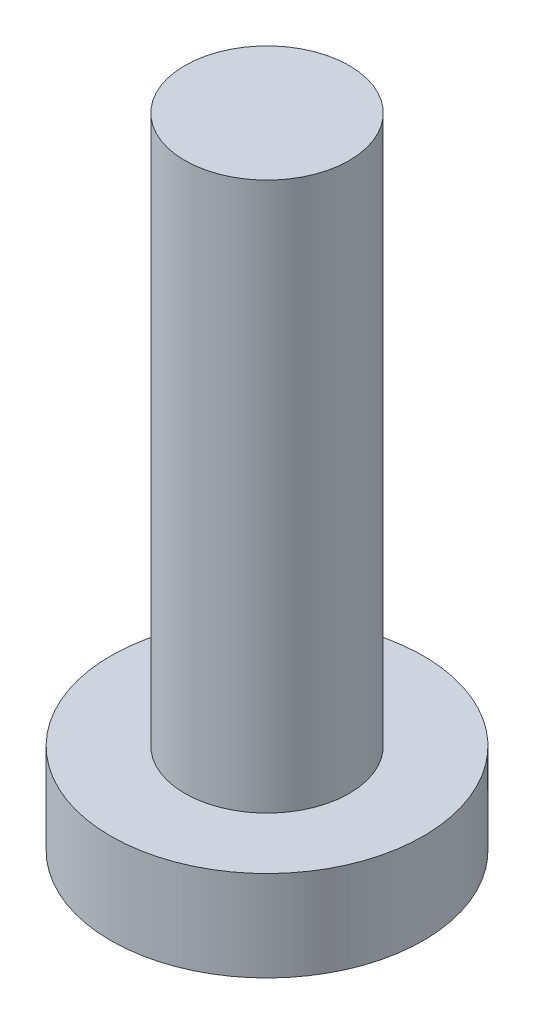
ISO-10303-21;
HEADER;
FILE_DESCRIPTION(('STEP AP214'),'2;1');
FILE_NAME('part.step','',(''),(''),'','','');
FILE_SCHEMA(('AUTOMOTIVE_DESIGN { 1 0 10303 214 1 1 1 1 }'));
ENDSEC;
DATA;
#1=APPLICATION_CONTEXT('core data for automotive mechanical design processes');
#2=APPLICATION_PROTOCOL_DEFINITION('international standard','automotive_design',2000,#1);
#3=PRODUCT_CONTEXT('',#1,'mechanical');
#4=PRODUCT('Part','Part','',(#3));
#5=PRODUCT_RELATED_PRODUCT_CATEGORY('part','',(#4));
#6=PRODUCT_DEFINITION_FORMATION('','',#4);
#7=PRODUCT_DEFINITION_CONTEXT('part definition',#1,'design');
#8=PRODUCT_DEFINITION('design','',#6,#7);
#9=PRODUCT_DEFINITION_SHAPE('','',#8);
#10=(LENGTH_UNIT() NAMED_UNIT(*) SI_UNIT(.MILLI.,.METRE.));
#11=(NAMED_UNIT(*) PLANE_ANGLE_UNIT() SI_UNIT($,.RADIAN.));
#12=(NAMED_UNIT(*) SI_UNIT($,.STERADIAN.) SOLID_ANGLE_UNIT());
#13=UNCERTAINTY_MEASURE_WITH_UNIT(LENGTH_MEASURE(1.E-05),#10,'distance_accuracy_value','');
#14=(GEOMETRIC_REPRESENTATION_CONTEXT(3) GLOBAL_UNCERTAINTY_ASSIGNED_CONTEXT((#13)) GLOBAL_UNIT_ASSIGNED_CONTEXT((#10,
#11,#12)) REPRESENTATION_CONTEXT('',''));
#15=CARTESIAN_POINT('',(0.,0.,0.));
#16=DIRECTION('',(0.,0.,1.));
#17=DIRECTION('',(1.,0.,0.));
#18=AXIS2_PLACEMENT_3D('',#15,#16,#17);
#19=CARTESIAN_POINT('',(0.,1.65,0.));
#20=DIRECTION('',(0.,-1.,0.));
#21=DIRECTION('',(0.,0.,-1.));
#22=AXIS2_PLACEMENT_3D('',#19,#20,#21);
#23=CYLINDRICAL_SURFACE('',#22,2.85);
#24=CARTESIAN_POINT('',(0.,1.65,0.));
#25=DIRECTION('',(0.,1.,0.));
#26=DIRECTION('',(0.,0.,1.));
#27=AXIS2_PLACEMENT_3D('',#24,#25,#26);
#28=CIRCLE('',#27,2.85);
#29=CARTESIAN_POINT('',(0.,1.65,2.85));
#30=VERTEX_POINT('',#29);
#31=EDGE_CURVE('E10',#30,#30,#28,.T.);
#32=ORIENTED_EDGE('',*,*,#31,.F.);
#33=EDGE_LOOP('',(#32));
#34=FACE_BOUND('',#33,.T.);
#35=CARTESIAN_POINT('',(0.,0.,0.));
#36=DIRECTION('',(0.,1.,0.));
#37=DIRECTION('',(0.,0.,1.));
#38=AXIS2_PLACEMENT_3D('',#35,#36,#37);
#39=CIRCLE('',#38,2.85);
#40=CARTESIAN_POINT('',(0.,0.,2.85));
#41=VERTEX_POINT('',#40);
#42=EDGE_CURVE('E35',#41,#41,#39,.T.);
#43=ORIENTED_EDGE('',*,*,#42,.T.);
#44=EDGE_LOOP('',(#43));
#45=FACE_BOUND('',#44,.T.);
#46=ADVANCED_FACE('F32',(#34,#45),#23,.T.);
#47=CARTESIAN_POINT('',(0.,1.65,0.));
#48=DIRECTION('',(0.,1.,0.));
#49=DIRECTION('',(0.,0.,1.));
#50=AXIS2_PLACEMENT_3D('',#47,#48,#49);
#51=PLANE('',#50);
#52=CARTESIAN_POINT('',(0.,1.65,0.));
#53=DIRECTION('',(0.,1.,0.));
#54=DIRECTION('',(0.,0.,1.));
#55=AXIS2_PLACEMENT_3D('',#52,#53,#54);
#56=CIRCLE('',#55,1.5);
#57=CARTESIAN_POINT('',(0.,1.65,1.5));
#58=VERTEX_POINT('',#57);
#59=EDGE_CURVE('E44',#58,#58,#56,.T.);
#60=ORIENTED_EDGE('',*,*,#59,.F.);
#61=EDGE_LOOP('',(#60));
#62=FACE_BOUND('',#61,.T.);
#63=ORIENTED_EDGE('',*,*,#31,.T.);
#64=EDGE_LOOP('',(#63));
#65=FACE_BOUND('',#64,.T.);
#66=ADVANCED_FACE('F59',(#62,#65),#51,.T.);
#67=CARTESIAN_POINT('',(0.,0.,0.));
#68=DIRECTION('',(0.,1.,0.));
#69=DIRECTION('',(0.,0.,1.));
#70=AXIS2_PLACEMENT_3D('',#67,#68,#69);
#71=PLANE('',#70);
#72=ORIENTED_EDGE('',*,*,#42,.F.);
#73=EDGE_LOOP('',(#72));
#74=FACE_BOUND('',#73,.T.);
#75=ADVANCED_FACE('F55',(#74),#71,.F.);
#76=CARTESIAN_POINT('',(0.,11.65,0.));
#77=DIRECTION('',(0.,-1.,0.));
#78=DIRECTION('',(0.,0.,-1.));
#79=AXIS2_PLACEMENT_3D('',#76,#77,#78);
#80=CYLINDRICAL_SURFACE('',#79,1.5);
#81=CARTESIAN_POINT('',(0.,11.65,0.));
#82=DIRECTION('',(0.,1.,0.));
#83=DIRECTION('',(0.,0.,1.));
#84=AXIS2_PLACEMENT_3D('',#81,#82,#83);
#85=CIRCLE('',#84,1.5);
#86=CARTESIAN_POINT('',(0.,11.65,1.5));
#87=VERTEX_POINT('',#86);
#88=EDGE_CURVE('E42',#87,#87,#85,.T.);
#89=ORIENTED_EDGE('',*,*,#88,.F.);
#90=EDGE_LOOP('',(#89));
#91=FACE_BOUND('',#90,.T.);
#92=ORIENTED_EDGE('',*,*,#59,.T.);
#93=EDGE_LOOP('',(#92));
#94=FACE_BOUND('',#93,.T.);
#95=ADVANCED_FACE('F52',(#91,#94),#80,.T.);
#96=CARTESIAN_POINT('',(0.,11.65,0.));
#97=DIRECTION('',(0.,1.,0.));
#98=DIRECTION('',(0.,0.,1.));
#99=AXIS2_PLACEMENT_3D('',#96,#97,#98);
#100=PLANE('',#99);
#101=ORIENTED_EDGE('',*,*,#88,.T.);
#102=EDGE_LOOP('',(#101));
#103=FACE_BOUND('',#102,.T.);
#104=ADVANCED_FACE('F50',(#103),#100,.T.);
#105=CLOSED_SHELL('',(#46,#66,#75,#95,#104));
#106=MANIFOLD_SOLID_BREP('B2',#105);
#107=ADVANCED_BREP_SHAPE_REPRESENTATION('',(#18,#106),#14);
#108=SHAPE_DEFINITION_REPRESENTATION(#9,#107);
ENDSEC;
END-ISO-10303-21;
